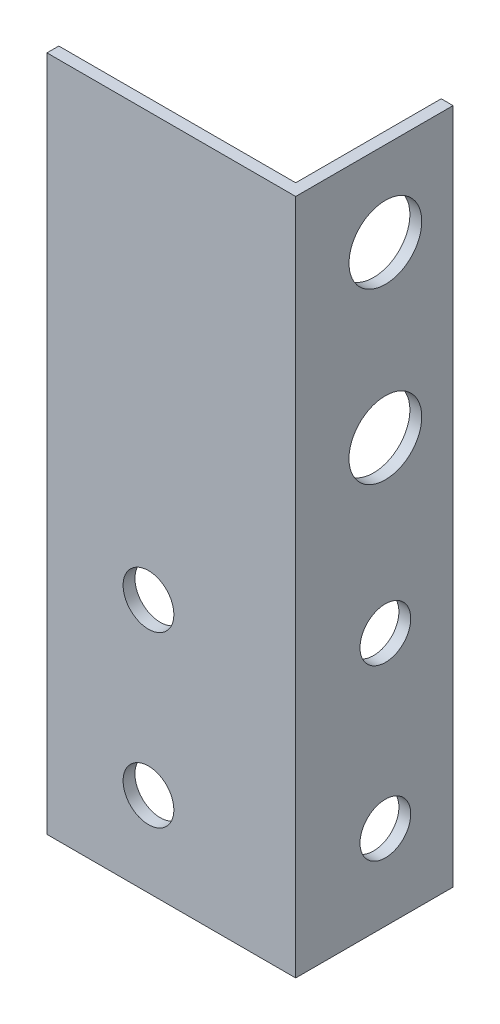
ISO-10303-21;
HEADER;
FILE_DESCRIPTION(('STEP AP214'),'2;1');
FILE_NAME('part.step','',(''),(''),'','','');
FILE_SCHEMA(('AUTOMOTIVE_DESIGN { 1 0 10303 214 1 1 1 1 }'));
ENDSEC;
DATA;
#1=APPLICATION_CONTEXT('core data for automotive mechanical design processes');
#2=APPLICATION_PROTOCOL_DEFINITION('international standard','automotive_design',2000,#1);
#3=PRODUCT_CONTEXT('',#1,'mechanical');
#4=PRODUCT('Part','Part','',(#3));
#5=PRODUCT_RELATED_PRODUCT_CATEGORY('part','',(#4));
#6=PRODUCT_DEFINITION_FORMATION('','',#4);
#7=PRODUCT_DEFINITION_CONTEXT('part definition',#1,'design');
#8=PRODUCT_DEFINITION('design','',#6,#7);
#9=PRODUCT_DEFINITION_SHAPE('','',#8);
#10=(LENGTH_UNIT() NAMED_UNIT(*) SI_UNIT(.MILLI.,.METRE.));
#11=(NAMED_UNIT(*) PLANE_ANGLE_UNIT() SI_UNIT($,.RADIAN.));
#12=(NAMED_UNIT(*) SI_UNIT($,.STERADIAN.) SOLID_ANGLE_UNIT());
#13=UNCERTAINTY_MEASURE_WITH_UNIT(LENGTH_MEASURE(1.E-05),#10,'distance_accuracy_value','');
#14=(GEOMETRIC_REPRESENTATION_CONTEXT(3) GLOBAL_UNCERTAINTY_ASSIGNED_CONTEXT((#13)) GLOBAL_UNIT_ASSIGNED_CONTEXT((#10,
#11,#12)) REPRESENTATION_CONTEXT('',''));
#15=CARTESIAN_POINT('',(0.,0.,0.));
#16=DIRECTION('',(0.,0.,1.));
#17=DIRECTION('',(1.,0.,0.));
#18=AXIS2_PLACEMENT_3D('',#15,#16,#17);
#19=CARTESIAN_POINT('',(14.7,40.,0.));
#20=DIRECTION('',(0.,0.,-1.));
#21=DIRECTION('',(-1.,0.,0.));
#22=AXIS2_PLACEMENT_3D('',#19,#20,#21);
#23=PLANE('',#22);
#24=CARTESIAN_POINT('',(6.,15.0012231091434,0.));
#25=DIRECTION('',(0.,0.,1.));
#26=DIRECTION('',(1.,0.,0.));
#27=AXIS2_PLACEMENT_3D('',#24,#25,#26);
#28=CIRCLE('',#27,1.5);
#29=CARTESIAN_POINT('',(7.5,15.0012231091434,0.));
#30=VERTEX_POINT('',#29);
#31=EDGE_CURVE('E153',#30,#30,#28,.T.);
#32=ORIENTED_EDGE('',*,*,#31,.F.);
#33=EDGE_LOOP('',(#32));
#34=FACE_BOUND('',#33,.T.);
#35=CARTESIAN_POINT('',(6.00000000000001,5.,0.));
#36=DIRECTION('',(0.,0.,1.));
#37=DIRECTION('',(1.,0.,0.));
#38=AXIS2_PLACEMENT_3D('',#35,#36,#37);
#39=CIRCLE('',#38,1.5);
#40=CARTESIAN_POINT('',(7.50000000000001,5.,0.));
#41=VERTEX_POINT('',#40);
#42=EDGE_CURVE('E159',#41,#41,#39,.T.);
#43=ORIENTED_EDGE('',*,*,#42,.F.);
#44=EDGE_LOOP('',(#43));
#45=FACE_BOUND('',#44,.T.);
#46=DIRECTION('',(1.,0.,0.));
#47=VECTOR('',#46,1.);
#48=CARTESIAN_POINT('',(14.7,0.,0.));
#49=LINE('',#48,#47);
#50=CARTESIAN_POINT('',(0.,0.,0.));
#51=VERTEX_POINT('',#50);
#52=CARTESIAN_POINT('',(14.7,0.,0.));
#53=VERTEX_POINT('',#52);
#54=EDGE_CURVE('E123',#51,#53,#49,.T.);
#55=ORIENTED_EDGE('',*,*,#54,.T.);
#56=DIRECTION('',(0.,-1.,0.));
#57=VECTOR('',#56,1.);
#58=CARTESIAN_POINT('',(14.7,40.,0.));
#59=LINE('',#58,#57);
#60=CARTESIAN_POINT('',(14.7,40.,0.));
#61=VERTEX_POINT('',#60);
#62=EDGE_CURVE('E11',#61,#53,#59,.T.);
#63=ORIENTED_EDGE('',*,*,#62,.F.);
#64=DIRECTION('',(1.,0.,0.));
#65=VECTOR('',#64,1.);
#66=CARTESIAN_POINT('',(14.7,40.,0.));
#67=LINE('',#66,#65);
#68=CARTESIAN_POINT('',(0.,40.,0.));
#69=VERTEX_POINT('',#68);
#70=EDGE_CURVE('E134',#69,#61,#67,.T.);
#71=ORIENTED_EDGE('',*,*,#70,.F.);
#72=DIRECTION('',(0.,-1.,0.));
#73=VECTOR('',#72,1.);
#74=CARTESIAN_POINT('',(0.,40.,0.));
#75=LINE('',#74,#73);
#76=EDGE_CURVE('E119',#69,#51,#75,.T.);
#77=ORIENTED_EDGE('',*,*,#76,.T.);
#78=EDGE_LOOP('',(#55,#63,#71,#77));
#79=FACE_BOUND('',#78,.T.);
#80=ADVANCED_FACE('F37',(#34,#45,#79),#23,.F.);
#81=CARTESIAN_POINT('',(14.7,40.,-9.3));
#82=DIRECTION('',(-1.,0.,0.));
#83=DIRECTION('',(0.,0.,1.));
#84=AXIS2_PLACEMENT_3D('',#81,#82,#83);
#85=PLANE('',#84);
#86=CARTESIAN_POINT('',(14.7,35.,-5.3));
#87=DIRECTION('',(1.,0.,0.));
#88=DIRECTION('',(0.,0.,-1.));
#89=AXIS2_PLACEMENT_3D('',#86,#87,#88);
#90=CIRCLE('',#89,2.15);
#91=CARTESIAN_POINT('',(14.7,35.,-7.45));
#92=VERTEX_POINT('',#91);
#93=EDGE_CURVE('E144',#92,#92,#90,.T.);
#94=ORIENTED_EDGE('',*,*,#93,.F.);
#95=EDGE_LOOP('',(#94));
#96=FACE_BOUND('',#95,.T.);
#97=CARTESIAN_POINT('',(14.7,25.,-5.3));
#98=DIRECTION('',(1.,0.,0.));
#99=DIRECTION('',(0.,0.,1.));
#100=AXIS2_PLACEMENT_3D('',#97,#98,#99);
#101=CIRCLE('',#100,2.15);
#102=CARTESIAN_POINT('',(14.7,25.,-3.15));
#103=VERTEX_POINT('',#102);
#104=EDGE_CURVE('E168',#103,#103,#101,.T.);
#105=ORIENTED_EDGE('',*,*,#104,.F.);
#106=EDGE_LOOP('',(#105));
#107=FACE_BOUND('',#106,.T.);
#108=CARTESIAN_POINT('',(14.7,15.,-5.3));
#109=DIRECTION('',(1.,0.,0.));
#110=DIRECTION('',(0.,0.,-1.));
#111=AXIS2_PLACEMENT_3D('',#108,#109,#110);
#112=CIRCLE('',#111,1.5);
#113=CARTESIAN_POINT('',(14.7,15.,-6.8));
#114=VERTEX_POINT('',#113);
#115=EDGE_CURVE('E171',#114,#114,#112,.T.);
#116=ORIENTED_EDGE('',*,*,#115,.F.);
#117=EDGE_LOOP('',(#116));
#118=FACE_BOUND('',#117,.T.);
#119=CARTESIAN_POINT('',(14.7,4.99999999999999,-5.3));
#120=DIRECTION('',(1.,0.,0.));
#121=DIRECTION('',(0.,0.,-1.));
#122=AXIS2_PLACEMENT_3D('',#119,#120,#121);
#123=CIRCLE('',#122,1.5);
#124=CARTESIAN_POINT('',(14.7,4.99999999999999,-6.8));
#125=VERTEX_POINT('',#124);
#126=EDGE_CURVE('E157',#125,#125,#123,.T.);
#127=ORIENTED_EDGE('',*,*,#126,.F.);
#128=EDGE_LOOP('',(#127));
#129=FACE_BOUND('',#128,.T.);
#130=DIRECTION('',(0.,0.,-1.));
#131=VECTOR('',#130,1.);
#132=CARTESIAN_POINT('',(14.7,0.,-9.3));
#133=LINE('',#132,#131);
#134=CARTESIAN_POINT('',(14.7,0.,-9.3));
#135=VERTEX_POINT('',#134);
#136=EDGE_CURVE('E126',#53,#135,#133,.T.);
#137=ORIENTED_EDGE('',*,*,#136,.T.);
#138=DIRECTION('',(0.,-1.,0.));
#139=VECTOR('',#138,1.);
#140=CARTESIAN_POINT('',(14.7,40.,-9.3));
#141=LINE('',#140,#139);
#142=CARTESIAN_POINT('',(14.7,40.,-9.3));
#143=VERTEX_POINT('',#142);
#144=EDGE_CURVE('E46',#143,#135,#141,.T.);
#145=ORIENTED_EDGE('',*,*,#144,.F.);
#146=DIRECTION('',(0.,0.,-1.));
#147=VECTOR('',#146,1.);
#148=CARTESIAN_POINT('',(14.7,40.,-9.3));
#149=LINE('',#148,#147);
#150=EDGE_CURVE('E92',#61,#143,#149,.T.);
#151=ORIENTED_EDGE('',*,*,#150,.F.);
#152=ORIENTED_EDGE('',*,*,#62,.T.);
#153=EDGE_LOOP('',(#137,#145,#151,#152));
#154=FACE_BOUND('',#153,.T.);
#155=ADVANCED_FACE('F179',(#96,#107,#118,#129,#154),#85,.F.);
#156=CARTESIAN_POINT('',(14.,40.,-9.3));
#157=DIRECTION('',(0.,0.,1.));
#158=DIRECTION('',(1.,0.,0.));
#159=AXIS2_PLACEMENT_3D('',#156,#157,#158);
#160=PLANE('',#159);
#161=DIRECTION('',(-1.,0.,0.));
#162=VECTOR('',#161,1.);
#163=CARTESIAN_POINT('',(14.,0.,-9.3));
#164=LINE('',#163,#162);
#165=CARTESIAN_POINT('',(14.,0.,-9.3));
#166=VERTEX_POINT('',#165);
#167=EDGE_CURVE('E129',#135,#166,#164,.T.);
#168=ORIENTED_EDGE('',*,*,#167,.T.);
#169=DIRECTION('',(0.,-1.,0.));
#170=VECTOR('',#169,1.);
#171=CARTESIAN_POINT('',(14.,40.,-9.3));
#172=LINE('',#171,#170);
#173=CARTESIAN_POINT('',(14.,40.,-9.3));
#174=VERTEX_POINT('',#173);
#175=EDGE_CURVE('E114',#174,#166,#172,.T.);
#176=ORIENTED_EDGE('',*,*,#175,.F.);
#177=DIRECTION('',(-1.,0.,0.));
#178=VECTOR('',#177,1.);
#179=CARTESIAN_POINT('',(14.,40.,-9.3));
#180=LINE('',#179,#178);
#181=EDGE_CURVE('E105',#143,#174,#180,.T.);
#182=ORIENTED_EDGE('',*,*,#181,.F.);
#183=ORIENTED_EDGE('',*,*,#144,.T.);
#184=EDGE_LOOP('',(#168,#176,#182,#183));
#185=FACE_BOUND('',#184,.T.);
#186=ADVANCED_FACE('F182',(#185),#160,.F.);
#187=CARTESIAN_POINT('',(14.,40.,-0.7));
#188=DIRECTION('',(1.,0.,0.));
#189=DIRECTION('',(0.,0.,-1.));
#190=AXIS2_PLACEMENT_3D('',#187,#188,#189);
#191=PLANE('',#190);
#192=CARTESIAN_POINT('',(14.,35.,-5.3));
#193=DIRECTION('',(1.,0.,0.));
#194=DIRECTION('',(0.,0.,-1.));
#195=AXIS2_PLACEMENT_3D('',#192,#193,#194);
#196=CIRCLE('',#195,2.15);
#197=CARTESIAN_POINT('',(14.,35.,-7.45));
#198=VERTEX_POINT('',#197);
#199=EDGE_CURVE('E127',#198,#198,#196,.T.);
#200=ORIENTED_EDGE('',*,*,#199,.T.);
#201=EDGE_LOOP('',(#200));
#202=FACE_BOUND('',#201,.T.);
#203=CARTESIAN_POINT('',(14.,25.,-5.3));
#204=DIRECTION('',(1.,0.,0.));
#205=DIRECTION('',(0.,0.,-1.));
#206=AXIS2_PLACEMENT_3D('',#203,#204,#205);
#207=CIRCLE('',#206,2.15);
#208=CARTESIAN_POINT('',(14.,25.,-7.45));
#209=VERTEX_POINT('',#208);
#210=EDGE_CURVE('E147',#209,#209,#207,.T.);
#211=ORIENTED_EDGE('',*,*,#210,.T.);
#212=EDGE_LOOP('',(#211));
#213=FACE_BOUND('',#212,.T.);
#214=CARTESIAN_POINT('',(14.,15.,-5.3));
#215=DIRECTION('',(1.,0.,0.));
#216=DIRECTION('',(0.,0.,-1.));
#217=AXIS2_PLACEMENT_3D('',#214,#215,#216);
#218=CIRCLE('',#217,1.5);
#219=CARTESIAN_POINT('',(14.,15.,-6.8));
#220=VERTEX_POINT('',#219);
#221=EDGE_CURVE('E143',#220,#220,#218,.T.);
#222=ORIENTED_EDGE('',*,*,#221,.T.);
#223=EDGE_LOOP('',(#222));
#224=FACE_BOUND('',#223,.T.);
#225=CARTESIAN_POINT('',(14.,4.99999999999999,-5.3));
#226=DIRECTION('',(1.,0.,0.));
#227=DIRECTION('',(0.,0.,-1.));
#228=AXIS2_PLACEMENT_3D('',#225,#226,#227);
#229=CIRCLE('',#228,1.5);
#230=CARTESIAN_POINT('',(14.,4.99999999999999,-6.8));
#231=VERTEX_POINT('',#230);
#232=EDGE_CURVE('E140',#231,#231,#229,.T.);
#233=ORIENTED_EDGE('',*,*,#232,.T.);
#234=EDGE_LOOP('',(#233));
#235=FACE_BOUND('',#234,.T.);
#236=DIRECTION('',(0.,0.,1.));
#237=VECTOR('',#236,1.);
#238=CARTESIAN_POINT('',(14.,0.,-0.7));
#239=LINE('',#238,#237);
#240=CARTESIAN_POINT('',(14.,0.,-0.7));
#241=VERTEX_POINT('',#240);
#242=EDGE_CURVE('E113',#166,#241,#239,.T.);
#243=ORIENTED_EDGE('',*,*,#242,.T.);
#244=DIRECTION('',(0.,-1.,0.));
#245=VECTOR('',#244,1.);
#246=CARTESIAN_POINT('',(14.,40.,-0.7));
#247=LINE('',#246,#245);
#248=CARTESIAN_POINT('',(14.,40.,-0.7));
#249=VERTEX_POINT('',#248);
#250=EDGE_CURVE('E110',#249,#241,#247,.T.);
#251=ORIENTED_EDGE('',*,*,#250,.F.);
#252=DIRECTION('',(0.,0.,1.));
#253=VECTOR('',#252,1.);
#254=CARTESIAN_POINT('',(14.,40.,-0.7));
#255=LINE('',#254,#253);
#256=EDGE_CURVE('E99',#174,#249,#255,.T.);
#257=ORIENTED_EDGE('',*,*,#256,.F.);
#258=ORIENTED_EDGE('',*,*,#175,.T.);
#259=EDGE_LOOP('',(#243,#251,#257,#258));
#260=FACE_BOUND('',#259,.T.);
#261=ADVANCED_FACE('F111',(#202,#213,#224,#235,#260),#191,.F.);
#262=CARTESIAN_POINT('',(0.,40.,-0.7));
#263=DIRECTION('',(0.,0.,1.));
#264=DIRECTION('',(1.,0.,0.));
#265=AXIS2_PLACEMENT_3D('',#262,#263,#264);
#266=PLANE('',#265);
#267=CARTESIAN_POINT('',(6.,15.0012231091434,-0.699999999999999));
#268=DIRECTION('',(0.,0.,1.));
#269=DIRECTION('',(1.,0.,0.));
#270=AXIS2_PLACEMENT_3D('',#267,#268,#269);
#271=CIRCLE('',#270,1.5);
#272=CARTESIAN_POINT('',(7.5,15.0012231091434,-0.699999999999999));
#273=VERTEX_POINT('',#272);
#274=EDGE_CURVE('E40',#273,#273,#271,.T.);
#275=ORIENTED_EDGE('',*,*,#274,.T.);
#276=EDGE_LOOP('',(#275));
#277=FACE_BOUND('',#276,.T.);
#278=CARTESIAN_POINT('',(6.00000000000001,5.,-0.699999999999999));
#279=DIRECTION('',(0.,0.,1.));
#280=DIRECTION('',(1.,0.,0.));
#281=AXIS2_PLACEMENT_3D('',#278,#279,#280);
#282=CIRCLE('',#281,1.5);
#283=CARTESIAN_POINT('',(7.50000000000001,5.,-0.699999999999999));
#284=VERTEX_POINT('',#283);
#285=EDGE_CURVE('E151',#284,#284,#282,.T.);
#286=ORIENTED_EDGE('',*,*,#285,.T.);
#287=EDGE_LOOP('',(#286));
#288=FACE_BOUND('',#287,.T.);
#289=DIRECTION('',(-1.,0.,0.));
#290=VECTOR('',#289,1.);
#291=CARTESIAN_POINT('',(0.,0.,-0.7));
#292=LINE('',#291,#290);
#293=CARTESIAN_POINT('',(0.,0.,-0.7));
#294=VERTEX_POINT('',#293);
#295=EDGE_CURVE('E78',#241,#294,#292,.T.);
#296=ORIENTED_EDGE('',*,*,#295,.T.);
#297=DIRECTION('',(0.,-1.,0.));
#298=VECTOR('',#297,1.);
#299=CARTESIAN_POINT('',(0.,40.,-0.7));
#300=LINE('',#299,#298);
#301=CARTESIAN_POINT('',(0.,40.,-0.7));
#302=VERTEX_POINT('',#301);
#303=EDGE_CURVE('E115',#302,#294,#300,.T.);
#304=ORIENTED_EDGE('',*,*,#303,.F.);
#305=DIRECTION('',(-1.,0.,0.));
#306=VECTOR('',#305,1.);
#307=CARTESIAN_POINT('',(0.,40.,-0.7));
#308=LINE('',#307,#306);
#309=EDGE_CURVE('E103',#249,#302,#308,.T.);
#310=ORIENTED_EDGE('',*,*,#309,.F.);
#311=ORIENTED_EDGE('',*,*,#250,.T.);
#312=EDGE_LOOP('',(#296,#304,#310,#311));
#313=FACE_BOUND('',#312,.T.);
#314=ADVANCED_FACE('F117',(#277,#288,#313),#266,.F.);
#315=CARTESIAN_POINT('',(0.,40.,0.));
#316=DIRECTION('',(1.,0.,0.));
#317=DIRECTION('',(0.,0.,-1.));
#318=AXIS2_PLACEMENT_3D('',#315,#316,#317);
#319=PLANE('',#318);
#320=DIRECTION('',(0.,0.,1.));
#321=VECTOR('',#320,1.);
#322=CARTESIAN_POINT('',(0.,0.,0.));
#323=LINE('',#322,#321);
#324=EDGE_CURVE('E84',#294,#51,#323,.T.);
#325=ORIENTED_EDGE('',*,*,#324,.T.);
#326=ORIENTED_EDGE('',*,*,#76,.F.);
#327=DIRECTION('',(0.,0.,1.));
#328=VECTOR('',#327,1.);
#329=CARTESIAN_POINT('',(0.,40.,0.));
#330=LINE('',#329,#328);
#331=EDGE_CURVE('E55',#302,#69,#330,.T.);
#332=ORIENTED_EDGE('',*,*,#331,.F.);
#333=ORIENTED_EDGE('',*,*,#303,.T.);
#334=EDGE_LOOP('',(#325,#326,#332,#333));
#335=FACE_BOUND('',#334,.T.);
#336=ADVANCED_FACE('F187',(#335),#319,.F.);
#337=CARTESIAN_POINT('',(0.,40.,0.));
#338=DIRECTION('',(0.,-1.,0.));
#339=DIRECTION('',(0.,0.,-1.));
#340=AXIS2_PLACEMENT_3D('',#337,#338,#339);
#341=PLANE('',#340);
#342=ORIENTED_EDGE('',*,*,#70,.T.);
#343=ORIENTED_EDGE('',*,*,#150,.T.);
#344=ORIENTED_EDGE('',*,*,#181,.T.);
#345=ORIENTED_EDGE('',*,*,#256,.T.);
#346=ORIENTED_EDGE('',*,*,#309,.T.);
#347=ORIENTED_EDGE('',*,*,#331,.T.);
#348=EDGE_LOOP('',(#342,#343,#344,#345,#346,#347));
#349=FACE_BOUND('',#348,.T.);
#350=ADVANCED_FACE('F101',(#349),#341,.F.);
#351=CARTESIAN_POINT('',(0.,0.,0.));
#352=DIRECTION('',(0.,-1.,0.));
#353=DIRECTION('',(0.,0.,-1.));
#354=AXIS2_PLACEMENT_3D('',#351,#352,#353);
#355=PLANE('',#354);
#356=ORIENTED_EDGE('',*,*,#54,.F.);
#357=ORIENTED_EDGE('',*,*,#324,.F.);
#358=ORIENTED_EDGE('',*,*,#295,.F.);
#359=ORIENTED_EDGE('',*,*,#242,.F.);
#360=ORIENTED_EDGE('',*,*,#167,.F.);
#361=ORIENTED_EDGE('',*,*,#136,.F.);
#362=EDGE_LOOP('',(#356,#357,#358,#359,#360,#361));
#363=FACE_BOUND('',#362,.T.);
#364=ADVANCED_FACE('F185',(#363),#355,.T.);
#365=CARTESIAN_POINT('',(0.,4.99999999999999,-5.3));
#366=DIRECTION('',(1.,0.,0.));
#367=DIRECTION('',(0.,0.,-1.));
#368=AXIS2_PLACEMENT_3D('',#365,#366,#367);
#369=CYLINDRICAL_SURFACE('',#368,1.5);
#370=ORIENTED_EDGE('',*,*,#126,.T.);
#371=EDGE_LOOP('',(#370));
#372=FACE_BOUND('',#371,.T.);
#373=ORIENTED_EDGE('',*,*,#232,.F.);
#374=EDGE_LOOP('',(#373));
#375=FACE_BOUND('',#374,.T.);
#376=ADVANCED_FACE('F228',(#372,#375),#369,.F.);
#377=CARTESIAN_POINT('',(0.,15.,-5.3));
#378=DIRECTION('',(1.,0.,0.));
#379=DIRECTION('',(0.,0.,-1.));
#380=AXIS2_PLACEMENT_3D('',#377,#378,#379);
#381=CYLINDRICAL_SURFACE('',#380,1.5);
#382=ORIENTED_EDGE('',*,*,#115,.T.);
#383=EDGE_LOOP('',(#382));
#384=FACE_BOUND('',#383,.T.);
#385=ORIENTED_EDGE('',*,*,#221,.F.);
#386=EDGE_LOOP('',(#385));
#387=FACE_BOUND('',#386,.T.);
#388=ADVANCED_FACE('F224',(#384,#387),#381,.F.);
#389=CARTESIAN_POINT('',(0.,25.,-5.3));
#390=DIRECTION('',(1.,0.,0.));
#391=DIRECTION('',(0.,0.,-1.));
#392=AXIS2_PLACEMENT_3D('',#389,#390,#391);
#393=CYLINDRICAL_SURFACE('',#392,2.15);
#394=ORIENTED_EDGE('',*,*,#104,.T.);
#395=EDGE_LOOP('',(#394));
#396=FACE_BOUND('',#395,.T.);
#397=ORIENTED_EDGE('',*,*,#210,.F.);
#398=EDGE_LOOP('',(#397));
#399=FACE_BOUND('',#398,.T.);
#400=ADVANCED_FACE('F218',(#396,#399),#393,.F.);
#401=CARTESIAN_POINT('',(0.,35.,-5.3));
#402=DIRECTION('',(1.,0.,0.));
#403=DIRECTION('',(0.,0.,-1.));
#404=AXIS2_PLACEMENT_3D('',#401,#402,#403);
#405=CYLINDRICAL_SURFACE('',#404,2.15);
#406=ORIENTED_EDGE('',*,*,#93,.T.);
#407=EDGE_LOOP('',(#406));
#408=FACE_BOUND('',#407,.T.);
#409=ORIENTED_EDGE('',*,*,#199,.F.);
#410=EDGE_LOOP('',(#409));
#411=FACE_BOUND('',#410,.T.);
#412=ADVANCED_FACE('F211',(#408,#411),#405,.F.);
#413=CARTESIAN_POINT('',(6.00000000000001,5.,-9.3));
#414=DIRECTION('',(0.,0.,1.));
#415=DIRECTION('',(1.,0.,0.));
#416=AXIS2_PLACEMENT_3D('',#413,#414,#415);
#417=CYLINDRICAL_SURFACE('',#416,1.5);
#418=ORIENTED_EDGE('',*,*,#42,.T.);
#419=EDGE_LOOP('',(#418));
#420=FACE_BOUND('',#419,.T.);
#421=ORIENTED_EDGE('',*,*,#285,.F.);
#422=EDGE_LOOP('',(#421));
#423=FACE_BOUND('',#422,.T.);
#424=ADVANCED_FACE('F207',(#420,#423),#417,.F.);
#425=CARTESIAN_POINT('',(6.,15.0012231091434,-9.3));
#426=DIRECTION('',(0.,0.,1.));
#427=DIRECTION('',(1.,0.,0.));
#428=AXIS2_PLACEMENT_3D('',#425,#426,#427);
#429=CYLINDRICAL_SURFACE('',#428,1.5);
#430=ORIENTED_EDGE('',*,*,#31,.T.);
#431=EDGE_LOOP('',(#430));
#432=FACE_BOUND('',#431,.T.);
#433=ORIENTED_EDGE('',*,*,#274,.F.);
#434=EDGE_LOOP('',(#433));
#435=FACE_BOUND('',#434,.T.);
#436=ADVANCED_FACE('F210',(#432,#435),#429,.F.);
#437=CLOSED_SHELL('',(#80,#155,#186,#261,#314,#336,#350,#364,#376,#388,#400,#412,#424,#436));
#438=MANIFOLD_SOLID_BREP('B2',#437);
#439=ADVANCED_BREP_SHAPE_REPRESENTATION('',(#18,#438),#14);
#440=SHAPE_DEFINITION_REPRESENTATION(#9,#439);
ENDSEC;
END-ISO-10303-21;
